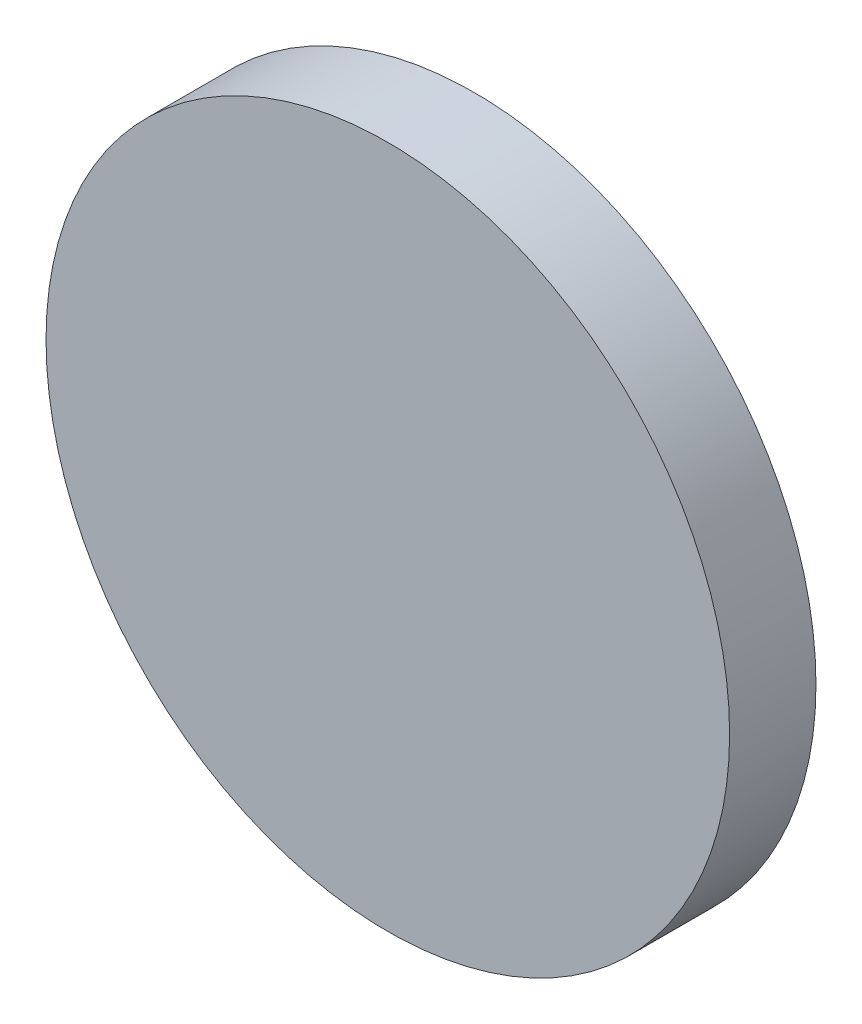
ISO-10303-21;
HEADER;
FILE_DESCRIPTION(('STEP AP214'),'2;1');
FILE_NAME('part.step','',(''),(''),'','','');
FILE_SCHEMA(('AUTOMOTIVE_DESIGN { 1 0 10303 214 1 1 1 1 }'));
ENDSEC;
DATA;
#1=APPLICATION_CONTEXT('core data for automotive mechanical design processes');
#2=APPLICATION_PROTOCOL_DEFINITION('international standard','automotive_design',2000,#1);
#3=PRODUCT_CONTEXT('',#1,'mechanical');
#4=PRODUCT('Part','Part','',(#3));
#5=PRODUCT_RELATED_PRODUCT_CATEGORY('part','',(#4));
#6=PRODUCT_DEFINITION_FORMATION('','',#4);
#7=PRODUCT_DEFINITION_CONTEXT('part definition',#1,'design');
#8=PRODUCT_DEFINITION('design','',#6,#7);
#9=PRODUCT_DEFINITION_SHAPE('','',#8);
#10=(LENGTH_UNIT() NAMED_UNIT(*) SI_UNIT(.MILLI.,.METRE.));
#11=(NAMED_UNIT(*) PLANE_ANGLE_UNIT() SI_UNIT($,.RADIAN.));
#12=(NAMED_UNIT(*) SI_UNIT($,.STERADIAN.) SOLID_ANGLE_UNIT());
#13=UNCERTAINTY_MEASURE_WITH_UNIT(LENGTH_MEASURE(1.E-05),#10,'distance_accuracy_value','');
#14=(GEOMETRIC_REPRESENTATION_CONTEXT(3) GLOBAL_UNCERTAINTY_ASSIGNED_CONTEXT((#13)) GLOBAL_UNIT_ASSIGNED_CONTEXT((#10,
#11,#12)) REPRESENTATION_CONTEXT('',''));
#15=CARTESIAN_POINT('',(0.,0.,0.));
#16=DIRECTION('',(0.,0.,1.));
#17=DIRECTION('',(1.,0.,0.));
#18=AXIS2_PLACEMENT_3D('',#15,#16,#17);
#19=CARTESIAN_POINT('',(0.,0.,12.));
#20=DIRECTION('',(0.,0.,-1.));
#21=DIRECTION('',(-1.,0.,0.));
#22=AXIS2_PLACEMENT_3D('',#19,#20,#21);
#23=CYLINDRICAL_SURFACE('',#22,47.5);
#24=CARTESIAN_POINT('',(0.,0.,12.));
#25=DIRECTION('',(0.,0.,1.));
#26=DIRECTION('',(1.,0.,0.));
#27=AXIS2_PLACEMENT_3D('',#24,#25,#26);
#28=CIRCLE('',#27,47.5);
#29=CARTESIAN_POINT('',(47.5,0.,12.));
#30=VERTEX_POINT('',#29);
#31=EDGE_CURVE('E10',#30,#30,#28,.T.);
#32=ORIENTED_EDGE('',*,*,#31,.F.);
#33=EDGE_LOOP('',(#32));
#34=FACE_BOUND('',#33,.T.);
#35=CARTESIAN_POINT('',(0.,0.,0.));
#36=DIRECTION('',(0.,0.,1.));
#37=DIRECTION('',(1.,0.,0.));
#38=AXIS2_PLACEMENT_3D('',#35,#36,#37);
#39=CIRCLE('',#38,47.5);
#40=CARTESIAN_POINT('',(47.5,0.,0.));
#41=VERTEX_POINT('',#40);
#42=EDGE_CURVE('E34',#41,#41,#39,.T.);
#43=ORIENTED_EDGE('',*,*,#42,.T.);
#44=EDGE_LOOP('',(#43));
#45=FACE_BOUND('',#44,.T.);
#46=ADVANCED_FACE('F31',(#34,#45),#23,.T.);
#47=CARTESIAN_POINT('',(0.,0.,12.));
#48=DIRECTION('',(0.,0.,1.));
#49=DIRECTION('',(1.,0.,0.));
#50=AXIS2_PLACEMENT_3D('',#47,#48,#49);
#51=PLANE('',#50);
#52=ORIENTED_EDGE('',*,*,#31,.T.);
#53=EDGE_LOOP('',(#52));
#54=FACE_BOUND('',#53,.T.);
#55=ADVANCED_FACE('F46',(#54),#51,.T.);
#56=CARTESIAN_POINT('',(0.,0.,0.));
#57=DIRECTION('',(0.,0.,1.));
#58=DIRECTION('',(1.,0.,0.));
#59=AXIS2_PLACEMENT_3D('',#56,#57,#58);
#60=PLANE('',#59);
#61=ORIENTED_EDGE('',*,*,#42,.F.);
#62=EDGE_LOOP('',(#61));
#63=FACE_BOUND('',#62,.T.);
#64=ADVANCED_FACE('F44',(#63),#60,.F.);
#65=CLOSED_SHELL('',(#46,#55,#64));
#66=MANIFOLD_SOLID_BREP('B2',#65);
#67=ADVANCED_BREP_SHAPE_REPRESENTATION('',(#18,#66),#14);
#68=SHAPE_DEFINITION_REPRESENTATION(#9,#67);
ENDSEC;
END-ISO-10303-21;
